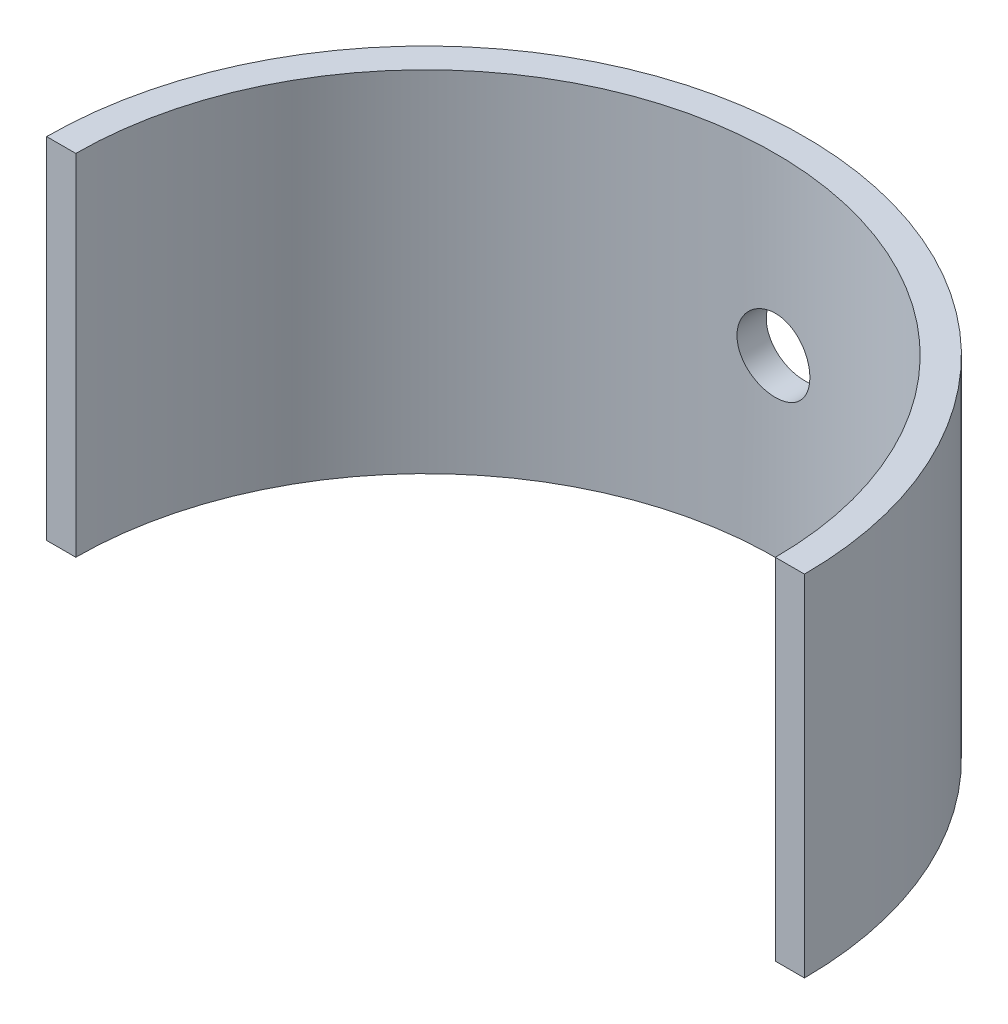
ISO-10303-21;
HEADER;
FILE_DESCRIPTION(('STEP AP214'),'2;1');
FILE_NAME('part.step','',(''),(''),'','','');
FILE_SCHEMA(('AUTOMOTIVE_DESIGN { 1 0 10303 214 1 1 1 1 }'));
ENDSEC;
DATA;
#1=APPLICATION_CONTEXT('core data for automotive mechanical design processes');
#2=APPLICATION_PROTOCOL_DEFINITION('international standard','automotive_design',2000,#1);
#3=PRODUCT_CONTEXT('',#1,'mechanical');
#4=PRODUCT('Part','Part','',(#3));
#5=PRODUCT_RELATED_PRODUCT_CATEGORY('part','',(#4));
#6=PRODUCT_DEFINITION_FORMATION('','',#4);
#7=PRODUCT_DEFINITION_CONTEXT('part definition',#1,'design');
#8=PRODUCT_DEFINITION('design','',#6,#7);
#9=PRODUCT_DEFINITION_SHAPE('','',#8);
#10=(LENGTH_UNIT() NAMED_UNIT(*) SI_UNIT(.MILLI.,.METRE.));
#11=(NAMED_UNIT(*) PLANE_ANGLE_UNIT() SI_UNIT($,.RADIAN.));
#12=(NAMED_UNIT(*) SI_UNIT($,.STERADIAN.) SOLID_ANGLE_UNIT());
#13=UNCERTAINTY_MEASURE_WITH_UNIT(LENGTH_MEASURE(1.E-05),#10,'distance_accuracy_value','');
#14=(GEOMETRIC_REPRESENTATION_CONTEXT(3) GLOBAL_UNCERTAINTY_ASSIGNED_CONTEXT((#13)) GLOBAL_UNIT_ASSIGNED_CONTEXT((#10,
#11,#12)) REPRESENTATION_CONTEXT('',''));
#15=CARTESIAN_POINT('',(0.,0.,0.));
#16=DIRECTION('',(0.,0.,1.));
#17=DIRECTION('',(1.,0.,0.));
#18=AXIS2_PLACEMENT_3D('',#15,#16,#17);
#19=CARTESIAN_POINT('',(0.,24.,0.));
#20=DIRECTION('',(0.,-1.,0.));
#21=DIRECTION('',(0.,0.,-1.));
#22=AXIS2_PLACEMENT_3D('',#19,#20,#21);
#23=CYLINDRICAL_SURFACE('',#22,24.);
#24=CARTESIAN_POINT('',(2.5,12.,-23.86943652456));
#25=CARTESIAN_POINT('',(2.49999395036586,11.8599832246459,-23.8694382298695));
#26=CARTESIAN_POINT('',(2.48819755384475,11.7198746351906,-23.8706818007527));
#27=CARTESIAN_POINT('',(2.4413188608177,11.4435442358054,-23.8755208531756));
#28=CARTESIAN_POINT('',(2.40621110340514,11.3073268457445,-23.8791189062426));
#29=CARTESIAN_POINT('',(2.3137450331214,11.0428204075146,-23.8882550438166));
#30=CARTESIAN_POINT('',(2.25640045324552,10.9145265225348,-23.8937919307362));
#31=CARTESIAN_POINT('',(2.12111540668472,10.669411620795,-23.9061804009208));
#32=CARTESIAN_POINT('',(2.04317894394126,10.5525883797024,-23.9130317285316));
#33=CARTESIAN_POINT('',(1.86859335681597,10.3332443642788,-23.9273072899531));
#34=CARTESIAN_POINT('',(1.77187968971059,10.2307750822709,-23.9347334450973));
#35=CARTESIAN_POINT('',(1.56262316619789,10.0434913384151,-23.9493045082558));
#36=CARTESIAN_POINT('',(1.45007957663017,9.95867769473684,-23.956449403224));
#37=CARTESIAN_POINT('',(1.21204098820845,9.80893359488784,-23.9696720137285));
#38=CARTESIAN_POINT('',(1.08651705686826,9.74404889424513,-23.9757472599864));
#39=CARTESIAN_POINT('',(0.826281573257587,9.63629728748482,-23.9861251117797));
#40=CARTESIAN_POINT('',(0.691570262679644,9.59342980241287,-23.9904277639258));
#41=CARTESIAN_POINT('',(0.417305459177956,9.53108100181706,-23.9967621408252));
#42=CARTESIAN_POINT('',(0.277771429200638,9.51151492049472,-23.998802094946));
#43=CARTESIAN_POINT('',(-0.002613811846588,9.49606199189853,-24.0004092348868));
#44=CARTESIAN_POINT('',(-0.143464985973968,9.50017448247812,-23.9999764898532));
#45=CARTESIAN_POINT('',(-0.421910641049745,9.53189328282181,-23.9966937137753));
#46=CARTESIAN_POINT('',(-0.559515631367176,9.55940844173653,-23.9938530614134));
#47=CARTESIAN_POINT('',(-0.828143882209227,9.63700944962783,-23.9860844237173));
#48=CARTESIAN_POINT('',(-0.959167051013619,9.68709561304317,-23.981156409304));
#49=CARTESIAN_POINT('',(-1.21119893396793,9.80851635264296,-23.9697508982507));
#50=CARTESIAN_POINT('',(-1.33218814297253,9.87989112939116,-23.9632704747021));
#51=CARTESIAN_POINT('',(-1.56050484042046,10.0418338303604,-23.9494869841781));
#52=CARTESIAN_POINT('',(-1.66783189370944,10.1324023656786,-23.9421838910137));
#53=CARTESIAN_POINT('',(-1.86631179201279,10.3306739932335,-23.9275333511659));
#54=CARTESIAN_POINT('',(-1.95738541965545,10.4384564011728,-23.9201858585332));
#55=CARTESIAN_POINT('',(-2.12015956338131,10.6678216164466,-23.9063091722462));
#56=CARTESIAN_POINT('',(-2.19186004729193,10.7894044466986,-23.8997799799509));
#57=CARTESIAN_POINT('',(-2.31385294659242,11.0429815615009,-23.8882786793639));
#58=CARTESIAN_POINT('',(-2.36414024904034,11.1749783237346,-23.8833069430294));
#59=CARTESIAN_POINT('',(-2.44181548565494,11.4456053227849,-23.8754910894602));
#60=CARTESIAN_POINT('',(-2.4692041782008,11.5842353397538,-23.8726469017636));
#61=CARTESIAN_POINT('',(-2.50020237554437,11.8634975729881,-23.8694204860846));
#62=CARTESIAN_POINT('',(-2.50392280476311,12.0041173492714,-23.8690267738159));
#63=CARTESIAN_POINT('',(-2.48777038453842,12.283978301328,-23.8707155709145));
#64=CARTESIAN_POINT('',(-2.46789788153291,12.4232194973139,-23.8727980439217));
#65=CARTESIAN_POINT('',(-2.40521659999996,12.6960460422206,-23.8791941167045));
#66=CARTESIAN_POINT('',(-2.36246046171754,12.8296436154427,-23.8835025951154));
#67=CARTESIAN_POINT('',(-2.25527940709318,13.0877709208686,-23.8938610672737));
#68=CARTESIAN_POINT('',(-2.19085395360283,13.212300428196,-23.899911104191));
#69=CARTESIAN_POINT('',(-2.04188597593413,13.4492616986747,-23.9130987635135));
#70=CARTESIAN_POINT('',(-1.95727006222385,13.5616471025042,-23.9202403185771));
#71=CARTESIAN_POINT('',(-1.7704280687069,13.7706594027123,-23.934793550986));
#72=CARTESIAN_POINT('',(-1.66820151554902,13.8672858753753,-23.9422052355878));
#73=CARTESIAN_POINT('',(-1.44855835337444,14.0424210462419,-23.9564983786243));
#74=CARTESIAN_POINT('',(-1.33108381894113,14.1208573019153,-23.9633776466747));
#75=CARTESIAN_POINT('',(-1.0845648043789,14.2568866066155,-23.9757988349445));
#76=CARTESIAN_POINT('',(-0.955520494474074,14.3144799622375,-23.9813407748354));
#77=CARTESIAN_POINT('',(-0.689776050466819,14.407066326348,-23.9904530148748));
#78=CARTESIAN_POINT('',(-0.553091195716336,14.4421028019152,-23.9940271051298));
#79=CARTESIAN_POINT('',(-0.275739553887446,14.4887226450657,-23.9988165237915));
#80=CARTESIAN_POINT('',(-0.135072889051547,14.5003067318527,-24.000031924531));
#81=CARTESIAN_POINT('',(0.145538459549632,14.4996823588266,-23.9999669389567));
#82=CARTESIAN_POINT('',(0.285483409537109,14.4875862418515,-23.9986983371596));
#83=CARTESIAN_POINT('',(0.561341473061535,14.4401807593585,-23.993831160868));
#84=CARTESIAN_POINT('',(0.697254584196515,14.4048713800116,-23.9902325849854));
#85=CARTESIAN_POINT('',(0.961187878882937,14.3120734571546,-23.9811085323119));
#86=CARTESIAN_POINT('',(1.08920934478986,14.2545885281447,-23.975583369559));
#87=CARTESIAN_POINT('',(1.33380446688992,14.1190831637415,-23.9632214140115));
#88=CARTESIAN_POINT('',(1.45037815877416,14.0410627923751,-23.9563846253065));
#89=CARTESIAN_POINT('',(1.66934422236605,13.8662806369535,-23.9421261313949));
#90=CARTESIAN_POINT('',(1.77166963237667,13.7694351670963,-23.9347019055569));
#91=CARTESIAN_POINT('',(1.95866561878316,13.5599189615299,-23.9201264707684));
#92=CARTESIAN_POINT('',(2.04333196214594,13.4472444422663,-23.912975327613));
#93=CARTESIAN_POINT('',(2.19279226808544,13.2089279342177,-23.8997348198932));
#94=CARTESIAN_POINT('',(2.25753123364313,13.0832513144999,-23.8936484134749));
#95=CARTESIAN_POINT('',(2.36489971629674,12.8228263821326,-23.8832616186159));
#96=CARTESIAN_POINT('',(2.40755403715805,12.6880884395514,-23.8789592275938));
#97=CARTESIAN_POINT('',(2.4589695197559,12.4604975228593,-23.8737065463064));
#98=CARTESIAN_POINT('',(2.47433475847007,12.3690968903414,-23.872112920544));
#99=CARTESIAN_POINT('',(2.49485197509758,12.1851442186864,-23.8699773482651));
#100=CARTESIAN_POINT('',(2.5000040005838,12.0925921849145,-23.86943539685));
#101=CARTESIAN_POINT('',(2.5,12.,-23.86943652456));
#102=B_SPLINE_CURVE_WITH_KNOTS('',3,(#24,#25,#26,#27,#28,#29,#30,#31,#32,#33,#34,#35,#36,#37,
#38,#39,#40,#41,#42,#43,#44,#45,#46,#47,#48,#49,#50,#51,#52,#53,#54,#55,#56,#57,#58,#59,#60,#61,
#62,#63,#64,#65,#66,#67,#68,#69,#70,#71,#72,#73,#74,#75,#76,#77,#78,#79,#80,#81,#82,#83,#84,#85,
#86,#87,#88,#89,#90,#91,#92,#93,#94,#95,#96,#97,#98,#99,#100,#101),.UNSPECIFIED.,.T.,.F.,(4,2,2,
2,2,2,2,2,2,2,2,2,2,2,2,2,2,2,2,2,2,2,2,2,2,2,2,2,2,2,2,2,2,2,2,2,2,2,4),(0.,0.419712177844766,
0.839883525330452,1.25979579601168,1.67962647782533,2.10092663934606,2.52224631974765,
2.94452621337464,3.36679500235963,3.78752292420687,4.20823908089379,4.62732405850326,
5.04641487460469,5.4663021501439,5.88620279620011,6.30809719653615,6.72999229749908,
7.15198808024103,7.57396988634863,7.99397255338649,8.41396905319391,8.83300354286511,
9.25204842051129,9.67264031544531,10.0932435171094,10.515494058364,10.9377383881394,
11.3591665987895,11.7805818854963,12.2000027522063,12.6194238687811,13.0387766507425,
13.4581281252319,13.8793882906101,14.3007493199821,14.7232630356289,15.1453011815164,
15.4228554138815,15.7004083534033),.UNSPECIFIED.);
#103=CARTESIAN_POINT('',(2.5,12.,-23.86943652456));
#104=VERTEX_POINT('',#103);
#105=EDGE_CURVE('E126',#104,#104,#102,.T.);
#106=ORIENTED_EDGE('',*,*,#105,.T.);
#107=EDGE_LOOP('',(#106));
#108=FACE_BOUND('',#107,.T.);
#109=CARTESIAN_POINT('',(0.,0.,0.));
#110=DIRECTION('',(0.,-1.,0.));
#111=DIRECTION('',(0.,0.,-1.));
#112=AXIS2_PLACEMENT_3D('',#109,#110,#111);
#113=CIRCLE('',#112,24.);
#114=CARTESIAN_POINT('',(-24.,0.,0.));
#115=VERTEX_POINT('',#114);
#116=CARTESIAN_POINT('',(24.,0.,0.));
#117=VERTEX_POINT('',#116);
#118=EDGE_CURVE('E122',#115,#117,#113,.T.);
#119=ORIENTED_EDGE('',*,*,#118,.T.);
#120=DIRECTION('',(0.,-1.,0.));
#121=VECTOR('',#120,1.);
#122=CARTESIAN_POINT('',(24.,24.,0.));
#123=LINE('',#122,#121);
#124=CARTESIAN_POINT('',(24.,24.,0.));
#125=VERTEX_POINT('',#124);
#126=EDGE_CURVE('E60',#125,#117,#123,.T.);
#127=ORIENTED_EDGE('',*,*,#126,.F.);
#128=CARTESIAN_POINT('',(0.,24.,0.));
#129=DIRECTION('',(0.,-1.,0.));
#130=DIRECTION('',(0.,0.,-1.));
#131=AXIS2_PLACEMENT_3D('',#128,#129,#130);
#132=CIRCLE('',#131,24.);
#133=CARTESIAN_POINT('',(-24.,24.,0.));
#134=VERTEX_POINT('',#133);
#135=EDGE_CURVE('E104',#134,#125,#132,.T.);
#136=ORIENTED_EDGE('',*,*,#135,.F.);
#137=DIRECTION('',(0.,-1.,0.));
#138=VECTOR('',#137,1.);
#139=CARTESIAN_POINT('',(-24.,24.,0.));
#140=LINE('',#139,#138);
#141=EDGE_CURVE('E118',#134,#115,#140,.T.);
#142=ORIENTED_EDGE('',*,*,#141,.T.);
#143=EDGE_LOOP('',(#119,#127,#136,#142));
#144=FACE_BOUND('',#143,.T.);
#145=ADVANCED_FACE('F45',(#108,#144),#23,.F.);
#146=CARTESIAN_POINT('',(24.,24.,0.));
#147=DIRECTION('',(0.,0.,-1.));
#148=DIRECTION('',(-1.,0.,0.));
#149=AXIS2_PLACEMENT_3D('',#146,#147,#148);
#150=PLANE('',#149);
#151=DIRECTION('',(1.,0.,0.));
#152=VECTOR('',#151,1.);
#153=CARTESIAN_POINT('',(24.,0.,0.));
#154=LINE('',#153,#152);
#155=CARTESIAN_POINT('',(26.,0.,0.));
#156=VERTEX_POINT('',#155);
#157=EDGE_CURVE('E110',#117,#156,#154,.T.);
#158=ORIENTED_EDGE('',*,*,#157,.T.);
#159=DIRECTION('',(0.,-1.,0.));
#160=VECTOR('',#159,1.);
#161=CARTESIAN_POINT('',(26.,24.,0.));
#162=LINE('',#161,#160);
#163=CARTESIAN_POINT('',(26.,24.,0.));
#164=VERTEX_POINT('',#163);
#165=EDGE_CURVE('E108',#164,#156,#162,.T.);
#166=ORIENTED_EDGE('',*,*,#165,.F.);
#167=DIRECTION('',(1.,0.,0.));
#168=VECTOR('',#167,1.);
#169=CARTESIAN_POINT('',(24.,24.,0.));
#170=LINE('',#169,#168);
#171=EDGE_CURVE('E99',#125,#164,#170,.T.);
#172=ORIENTED_EDGE('',*,*,#171,.F.);
#173=ORIENTED_EDGE('',*,*,#126,.T.);
#174=EDGE_LOOP('',(#158,#166,#172,#173));
#175=FACE_BOUND('',#174,.T.);
#176=ADVANCED_FACE('F109',(#175),#150,.F.);
#177=CARTESIAN_POINT('',(0.,24.,0.));
#178=DIRECTION('',(0.,-1.,0.));
#179=DIRECTION('',(0.,0.,-1.));
#180=AXIS2_PLACEMENT_3D('',#177,#178,#179);
#181=CYLINDRICAL_SURFACE('',#180,26.);
#182=CARTESIAN_POINT('',(0.,9.5,-26.));
#183=CARTESIAN_POINT('',(0.140079090854674,9.50000607954472,-25.9999984437906));
#184=CARTESIAN_POINT('',(0.28025147342537,9.51181292045134,-25.9988559141148));
#185=CARTESIAN_POINT('',(0.556712047945503,9.558735575232,-25.9944079975224));
#186=CARTESIAN_POINT('',(0.69299575552845,9.59387724867596,-25.9911002111345));
#187=CARTESIAN_POINT('',(0.957635386774747,9.68643877375372,-25.9826952711498));
#188=CARTESIAN_POINT('',(1.08599597155153,9.74384537947572,-25.9775991816262));
#189=CARTESIAN_POINT('',(1.33123092777168,9.87928197942211,-25.9661878781254));
#190=CARTESIAN_POINT('',(1.44810761925297,9.95730779624205,-25.9598729111596));
#191=CARTESIAN_POINT('',(1.66747611994793,10.1320479947142,-25.9467079644338));
#192=CARTESIAN_POINT('',(1.76992420977562,10.2288171512393,-25.9398564525333));
#193=CARTESIAN_POINT('',(1.95715176372564,10.4381804953508,-25.9264033385004));
#194=CARTESIAN_POINT('',(2.04193042099749,10.5507754052057,-25.9198017477916));
#195=CARTESIAN_POINT('',(2.19156588685478,10.7888657687647,-25.9075800992323));
#196=CARTESIAN_POINT('',(2.25638338608997,10.9143860361369,-25.9019619874055));
#197=CARTESIAN_POINT('',(2.36400558433373,11.1745917865878,-25.8923620817987));
#198=CARTESIAN_POINT('',(2.4068107887361,11.309277059161,-25.8883802504507));
#199=CARTESIAN_POINT('',(2.46906431941265,11.5835453932253,-25.8825173839812));
#200=CARTESIAN_POINT('',(2.48858488177617,11.7231119173661,-25.8806298529776));
#201=CARTESIAN_POINT('',(2.50393827325608,12.003552123584,-25.8791490548213));
#202=CARTESIAN_POINT('',(2.49977168094791,12.1444257736498,-25.8795557316307));
#203=CARTESIAN_POINT('',(2.46792861461948,12.4229841209804,-25.8826114739717));
#204=CARTESIAN_POINT('',(2.44033092173845,12.5606779180196,-25.8852530251998));
#205=CARTESIAN_POINT('',(2.36253158706054,12.8294701753833,-25.8924691316369));
#206=CARTESIAN_POINT('',(2.31232966068505,12.960568552651,-25.8970437111818));
#207=CARTESIAN_POINT('',(2.19065964060156,13.2126979766693,-25.9076190837894));
#208=CARTESIAN_POINT('',(2.11915649747563,13.3337120071787,-25.9136222241315));
#209=CARTESIAN_POINT('',(1.95693896043829,13.5620514185925,-25.9263762889278));
#210=CARTESIAN_POINT('',(1.86622404692758,13.6693764291394,-25.9331272336046));
#211=CARTESIAN_POINT('',(1.66771756427796,13.8677490999357,-25.9466497190775));
#212=CARTESIAN_POINT('',(1.55985794057086,13.9587286755267,-25.9534212317548));
#213=CARTESIAN_POINT('',(1.33036036240694,14.1213005107823,-25.9661958524457));
#214=CARTESIAN_POINT('',(1.20872239421452,14.1928927511195,-25.9721989596933));
#215=CARTESIAN_POINT('',(0.955074529864974,14.314654572159,-25.9827621399536));
#216=CARTESIAN_POINT('',(0.823063017475309,14.3648208067521,-25.9873219875431));
#217=CARTESIAN_POINT('',(0.55243715184782,14.4422572334155,-25.9944825144887));
#218=CARTESIAN_POINT('',(0.413822981243309,14.4695280583979,-25.9970832480017));
#219=CARTESIAN_POINT('',(0.134516292943449,14.500313423012,-26.0000255598987));
#220=CARTESIAN_POINT('',(-0.00616577666777429,14.5039219368079,-26.0003760748421));
#221=CARTESIAN_POINT('',(-0.286132732074384,14.4875269091482,-25.9988023954169));
#222=CARTESIAN_POINT('',(-0.425417635276576,14.4675236622326,-25.9968782294233));
#223=CARTESIAN_POINT('',(-0.698366045011985,14.4045508762007,-25.9909771818486));
#224=CARTESIAN_POINT('',(-0.832039769936612,14.3616252288135,-25.9870042237842));
#225=CARTESIAN_POINT('',(-1.09028867454175,14.2540711814364,-25.9774514488813));
#226=CARTESIAN_POINT('',(-1.21486366480817,14.1894423297939,-25.971871598603));
#227=CARTESIAN_POINT('',(-1.45180444623827,14.0400826287288,-25.959707247497));
#228=CARTESIAN_POINT('',(-1.56413107702371,13.9552899101502,-25.9531196773054));
#229=CARTESIAN_POINT('',(-1.77299047000319,13.7680983022725,-25.9396892637475));
#230=CARTESIAN_POINT('',(-1.86952286602531,13.6656990048971,-25.9328464144675));
#231=CARTESIAN_POINT('',(-2.0443789087774,13.4457914914339,-25.9196498912404));
#232=CARTESIAN_POINT('',(-2.12264096626374,13.3282341871747,-25.9132979188273));
#233=CARTESIAN_POINT('',(-2.25831163866799,13.0815903444793,-25.9018278100116));
#234=CARTESIAN_POINT('',(-2.31572052004911,12.9525039533887,-25.8967096578435));
#235=CARTESIAN_POINT('',(-2.40795165942864,12.686679134506,-25.8882970631817));
#236=CARTESIAN_POINT('',(-2.44281082321462,12.5499536097823,-25.884999642107));
#237=CARTESIAN_POINT('',(-2.48907285341934,12.2725568158129,-25.8805924383109));
#238=CARTESIAN_POINT('',(-2.50047633736266,12.1318856505441,-25.8794825979963));
#239=CARTESIAN_POINT('',(-2.49949509488683,11.8512028378354,-25.8795773402073));
#240=CARTESIAN_POINT('',(-2.48720712118753,11.7111908388983,-25.8807725093909));
#241=CARTESIAN_POINT('',(-2.43939436217775,11.435229742357,-25.8853225515069));
#242=CARTESIAN_POINT('',(-2.40386954819406,11.2992806497663,-25.8886774271044));
#243=CARTESIAN_POINT('',(-2.31061770191277,11.0353034956637,-25.897166294633));
#244=CARTESIAN_POINT('',(-2.25289324735918,10.907274516499,-25.9023000799965));
#245=CARTESIAN_POINT('',(-2.11689084932902,10.6627075929651,-25.9137687305501));
#246=CARTESIAN_POINT('',(-2.03861307185498,10.5461695557977,-25.9201035860394));
#247=CARTESIAN_POINT('',(-1.86336245414304,10.3273968050978,-25.9332915481553));
#248=CARTESIAN_POINT('',(-1.76631758951771,10.2252199030497,-25.9401465874947));
#249=CARTESIAN_POINT('',(-1.55642789703953,10.0385570801371,-25.9535848491687));
#250=CARTESIAN_POINT('',(-1.44357928104372,9.95407541295468,-25.9601680058418));
#251=CARTESIAN_POINT('',(-1.20499811214644,9.80504756252931,-25.9723366306832));
#252=CARTESIAN_POINT('',(-1.07923586421222,9.74054876168741,-25.9779197145149));
#253=CARTESIAN_POINT('',(-0.818694200894286,9.63366897565164,-25.987432796859));
#254=CARTESIAN_POINT('',(-0.683925197919736,9.59126293224055,-25.9913646672371));
#255=CARTESIAN_POINT('',(-0.456987645640414,9.54040237170735,-25.996139051485));
#256=CARTESIAN_POINT('',(-0.366272046132637,9.5252720435919,-25.9975801953512));
#257=CARTESIAN_POINT('',(-0.183717673427663,9.50506888275136,-25.999511178193));
#258=CARTESIAN_POINT('',(-0.0918789044356982,9.49999601238197,-26.0000010207292));
#259=CARTESIAN_POINT('',(0.,9.5,-26.));
#260=B_SPLINE_CURVE_WITH_KNOTS('',3,(#182,#183,#184,#185,#186,#187,#188,#189,#190,#191,#192,
#193,#194,#195,#196,#197,#198,#199,#200,#201,#202,#203,#204,#205,#206,#207,#208,#209,#210,#211,
#212,#213,#214,#215,#216,#217,#218,#219,#220,#221,#222,#223,#224,#225,#226,#227,#228,#229,#230,
#231,#232,#233,#234,#235,#236,#237,#238,#239,#240,#241,#242,#243,#244,#245,#246,#247,#248,#249,
#250,#251,#252,#253,#254,#255,#256,#257,#258,#259),.UNSPECIFIED.,.T.,.F.,(4,2,2,2,2,2,2,2,2,2,2,
2,2,2,2,2,2,2,2,2,2,2,2,2,2,2,2,2,2,2,2,2,2,2,2,2,2,2,4),(0.,0.419901777372053,
0.840269666585885,1.26038785209969,1.68042098780869,2.1017006561163,2.52299955737102,
2.94512289071348,3.3672365318342,3.78803721280071,4.20882761545858,4.62820879438876,
5.04759525331476,5.46767562620042,5.8877673619822,6.30957029209389,6.73137364270306,
7.15324284247044,7.57510037986229,7.99528150261323,8.41545738395725,8.8348315838985,
9.25421451172951,9.67490123167567,10.0955977033983,10.5176924982603,10.9397818993785,
11.3611787321835,11.782564470608,12.2022329710147,12.6219019892742,13.0415222917529,
13.4611392051987,13.8823996846186,14.3037613131246,14.726114539524,15.1479876725087,
15.4234053629249,15.6988220224717),.UNSPECIFIED.);
#261=CARTESIAN_POINT('',(0.,9.5,-26.));
#262=VERTEX_POINT('',#261);
#263=EDGE_CURVE('E11',#262,#262,#260,.T.);
#264=ORIENTED_EDGE('',*,*,#263,.T.);
#265=EDGE_LOOP('',(#264));
#266=FACE_BOUND('',#265,.T.);
#267=CARTESIAN_POINT('',(0.,0.,0.));
#268=DIRECTION('',(0.,1.,0.));
#269=DIRECTION('',(0.,0.,-1.));
#270=AXIS2_PLACEMENT_3D('',#267,#268,#269);
#271=CIRCLE('',#270,26.);
#272=CARTESIAN_POINT('',(-26.,0.,0.));
#273=VERTEX_POINT('',#272);
#274=EDGE_CURVE('E85',#156,#273,#271,.T.);
#275=ORIENTED_EDGE('',*,*,#274,.T.);
#276=DIRECTION('',(0.,-1.,0.));
#277=VECTOR('',#276,1.);
#278=CARTESIAN_POINT('',(-26.,24.,0.));
#279=LINE('',#278,#277);
#280=CARTESIAN_POINT('',(-26.,24.,0.));
#281=VERTEX_POINT('',#280);
#282=EDGE_CURVE('E112',#281,#273,#279,.T.);
#283=ORIENTED_EDGE('',*,*,#282,.F.);
#284=CARTESIAN_POINT('',(0.,24.,0.));
#285=DIRECTION('',(0.,1.,0.));
#286=DIRECTION('',(0.,0.,-1.));
#287=AXIS2_PLACEMENT_3D('',#284,#285,#286);
#288=CIRCLE('',#287,26.);
#289=EDGE_CURVE('E102',#164,#281,#288,.T.);
#290=ORIENTED_EDGE('',*,*,#289,.F.);
#291=ORIENTED_EDGE('',*,*,#165,.T.);
#292=EDGE_LOOP('',(#275,#283,#290,#291));
#293=FACE_BOUND('',#292,.T.);
#294=ADVANCED_FACE('F114',(#266,#293),#181,.T.);
#295=CARTESIAN_POINT('',(-26.,24.,0.));
#296=DIRECTION('',(0.,0.,-1.));
#297=DIRECTION('',(-1.,0.,0.));
#298=AXIS2_PLACEMENT_3D('',#295,#296,#297);
#299=PLANE('',#298);
#300=DIRECTION('',(1.,0.,0.));
#301=VECTOR('',#300,1.);
#302=CARTESIAN_POINT('',(-26.,0.,0.));
#303=LINE('',#302,#301);
#304=EDGE_CURVE('E91',#273,#115,#303,.T.);
#305=ORIENTED_EDGE('',*,*,#304,.T.);
#306=ORIENTED_EDGE('',*,*,#141,.F.);
#307=DIRECTION('',(1.,0.,0.));
#308=VECTOR('',#307,1.);
#309=CARTESIAN_POINT('',(-26.,24.,0.));
#310=LINE('',#309,#308);
#311=EDGE_CURVE('E68',#281,#134,#310,.T.);
#312=ORIENTED_EDGE('',*,*,#311,.F.);
#313=ORIENTED_EDGE('',*,*,#282,.T.);
#314=EDGE_LOOP('',(#305,#306,#312,#313));
#315=FACE_BOUND('',#314,.T.);
#316=ADVANCED_FACE('F150',(#315),#299,.F.);
#317=CARTESIAN_POINT('',(0.,24.,0.));
#318=DIRECTION('',(0.,-1.,0.));
#319=DIRECTION('',(0.,0.,-1.));
#320=AXIS2_PLACEMENT_3D('',#317,#318,#319);
#321=PLANE('',#320);
#322=ORIENTED_EDGE('',*,*,#135,.T.);
#323=ORIENTED_EDGE('',*,*,#171,.T.);
#324=ORIENTED_EDGE('',*,*,#289,.T.);
#325=ORIENTED_EDGE('',*,*,#311,.T.);
#326=EDGE_LOOP('',(#322,#323,#324,#325));
#327=FACE_BOUND('',#326,.T.);
#328=ADVANCED_FACE('F100',(#327),#321,.F.);
#329=CARTESIAN_POINT('',(0.,0.,0.));
#330=DIRECTION('',(0.,-1.,0.));
#331=DIRECTION('',(0.,0.,-1.));
#332=AXIS2_PLACEMENT_3D('',#329,#330,#331);
#333=PLANE('',#332);
#334=ORIENTED_EDGE('',*,*,#118,.F.);
#335=ORIENTED_EDGE('',*,*,#304,.F.);
#336=ORIENTED_EDGE('',*,*,#274,.F.);
#337=ORIENTED_EDGE('',*,*,#157,.F.);
#338=EDGE_LOOP('',(#334,#335,#336,#337));
#339=FACE_BOUND('',#338,.T.);
#340=ADVANCED_FACE('F140',(#339),#333,.T.);
#341=CARTESIAN_POINT('',(0.,12.,0.));
#342=DIRECTION('',(0.,0.,1.));
#343=DIRECTION('',(1.,0.,0.));
#344=AXIS2_PLACEMENT_3D('',#341,#342,#343);
#345=CYLINDRICAL_SURFACE('',#344,2.5);
#346=ORIENTED_EDGE('',*,*,#263,.F.);
#347=EDGE_LOOP('',(#346));
#348=FACE_BOUND('',#347,.T.);
#349=ORIENTED_EDGE('',*,*,#105,.F.);
#350=EDGE_LOOP('',(#349));
#351=FACE_BOUND('',#350,.T.);
#352=ADVANCED_FACE('F142',(#348,#351),#345,.F.);
#353=CLOSED_SHELL('',(#145,#176,#294,#316,#328,#340,#352));
#354=MANIFOLD_SOLID_BREP('B2',#353);
#355=ADVANCED_BREP_SHAPE_REPRESENTATION('',(#18,#354),#14);
#356=SHAPE_DEFINITION_REPRESENTATION(#9,#355);
ENDSEC;
END-ISO-10303-21;
